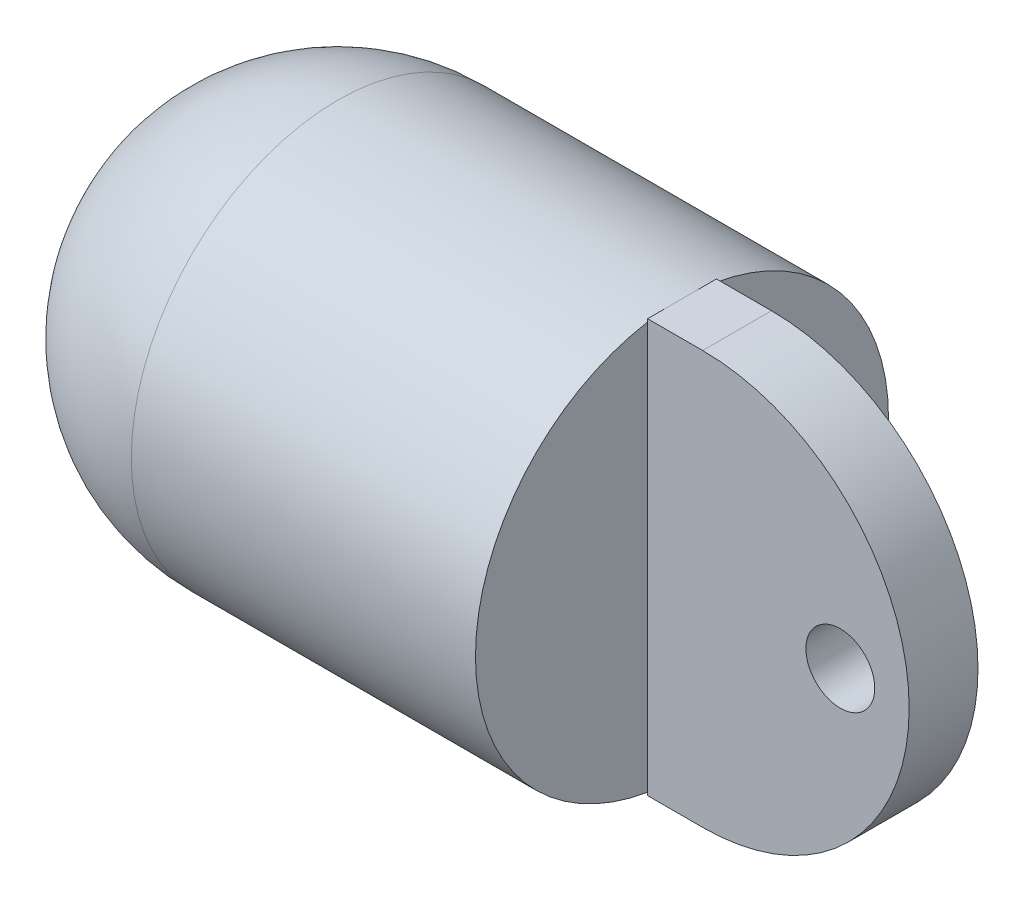
ISO-10303-21;
HEADER;
FILE_DESCRIPTION(('STEP AP214'),'2;1');
FILE_NAME('part.step','',(''),(''),'','','');
FILE_SCHEMA(('AUTOMOTIVE_DESIGN { 1 0 10303 214 1 1 1 1 }'));
ENDSEC;
DATA;
#1=APPLICATION_CONTEXT('core data for automotive mechanical design processes');
#2=APPLICATION_PROTOCOL_DEFINITION('international standard','automotive_design',2000,#1);
#3=PRODUCT_CONTEXT('',#1,'mechanical');
#4=PRODUCT('Part','Part','',(#3));
#5=PRODUCT_RELATED_PRODUCT_CATEGORY('part','',(#4));
#6=PRODUCT_DEFINITION_FORMATION('','',#4);
#7=PRODUCT_DEFINITION_CONTEXT('part definition',#1,'design');
#8=PRODUCT_DEFINITION('design','',#6,#7);
#9=PRODUCT_DEFINITION_SHAPE('','',#8);
#10=(LENGTH_UNIT() NAMED_UNIT(*) SI_UNIT(.MILLI.,.METRE.));
#11=(NAMED_UNIT(*) PLANE_ANGLE_UNIT() SI_UNIT($,.RADIAN.));
#12=(NAMED_UNIT(*) SI_UNIT($,.STERADIAN.) SOLID_ANGLE_UNIT());
#13=UNCERTAINTY_MEASURE_WITH_UNIT(LENGTH_MEASURE(1.E-05),#10,'distance_accuracy_value','');
#14=(GEOMETRIC_REPRESENTATION_CONTEXT(3) GLOBAL_UNCERTAINTY_ASSIGNED_CONTEXT((#13)) GLOBAL_UNIT_ASSIGNED_CONTEXT((#10,
#11,#12)) REPRESENTATION_CONTEXT('',''));
#15=CARTESIAN_POINT('',(0.,0.,0.));
#16=DIRECTION('',(0.,0.,1.));
#17=DIRECTION('',(1.,0.,0.));
#18=AXIS2_PLACEMENT_3D('',#15,#16,#17);
#19=CARTESIAN_POINT('',(0.,0.,0.));
#20=DIRECTION('',(1.,0.,0.));
#21=DIRECTION('',(0.,0.,-1.));
#22=AXIS2_PLACEMENT_3D('',#19,#20,#21);
#23=PLANE('',#22);
#24=DIRECTION('',(0.,1.,0.));
#25=VECTOR('',#24,1.);
#26=CARTESIAN_POINT('',(0.,15.,-2.5));
#27=LINE('',#26,#25);
#28=CARTESIAN_POINT('',(0.,-14.790199457749,-2.5));
#29=VERTEX_POINT('',#28);
#30=CARTESIAN_POINT('',(0.,14.790199457749,-2.5));
#31=VERTEX_POINT('',#30);
#32=EDGE_CURVE('E11',#29,#31,#27,.T.);
#33=ORIENTED_EDGE('',*,*,#32,.F.);
#34=CARTESIAN_POINT('',(0.,0.,0.));
#35=DIRECTION('',(1.,0.,0.));
#36=DIRECTION('',(0.,0.,-1.));
#37=AXIS2_PLACEMENT_3D('',#34,#35,#36);
#38=CIRCLE('',#37,15.);
#39=EDGE_CURVE('E165',#29,#31,#38,.T.);
#40=ORIENTED_EDGE('',*,*,#39,.T.);
#41=EDGE_LOOP('',(#33,#40));
#42=FACE_BOUND('',#41,.T.);
#43=ADVANCED_FACE('F39',(#42),#23,.T.);
#44=CARTESIAN_POINT('',(-25.,0.,0.));
#45=DIRECTION('',(1.,0.,0.));
#46=DIRECTION('',(0.,0.,-1.));
#47=AXIS2_PLACEMENT_3D('',#44,#45,#46);
#48=CYLINDRICAL_SURFACE('',#47,15.);
#49=CARTESIAN_POINT('',(-25.,0.,0.));
#50=DIRECTION('',(1.,0.,0.));
#51=DIRECTION('',(0.,0.,-1.));
#52=AXIS2_PLACEMENT_3D('',#49,#50,#51);
#53=CIRCLE('',#52,15.);
#54=CARTESIAN_POINT('',(-25.,0.,-15.));
#55=VERTEX_POINT('',#54);
#56=EDGE_CURVE('E243',#55,#55,#53,.F.);
#57=ORIENTED_EDGE('',*,*,#56,.F.);
#58=EDGE_LOOP('',(#57));
#59=FACE_BOUND('',#58,.T.);
#60=CARTESIAN_POINT('',(0.,15.,0.));
#61=VERTEX_POINT('',#60);
#62=EDGE_CURVE('E166',#31,#61,#38,.T.);
#63=ORIENTED_EDGE('',*,*,#62,.F.);
#64=ORIENTED_EDGE('',*,*,#39,.F.);
#65=CARTESIAN_POINT('',(0.,-15.,0.));
#66=VERTEX_POINT('',#65);
#67=EDGE_CURVE('E63',#66,#29,#38,.T.);
#68=ORIENTED_EDGE('',*,*,#67,.F.);
#69=CARTESIAN_POINT('',(0.,-14.790199457749,2.5));
#70=VERTEX_POINT('',#69);
#71=EDGE_CURVE('E181',#70,#66,#38,.T.);
#72=ORIENTED_EDGE('',*,*,#71,.F.);
#73=CARTESIAN_POINT('',(0.,14.790199457749,2.5));
#74=VERTEX_POINT('',#73);
#75=EDGE_CURVE('E178',#74,#70,#38,.T.);
#76=ORIENTED_EDGE('',*,*,#75,.F.);
#77=EDGE_CURVE('E169',#61,#74,#38,.T.);
#78=ORIENTED_EDGE('',*,*,#77,.F.);
#79=EDGE_LOOP('',(#63,#64,#68,#72,#76,#78));
#80=FACE_BOUND('',#79,.T.);
#81=ADVANCED_FACE('F41',(#59,#80),#48,.T.);
#82=DIRECTION('',(0.,-1.,0.));
#83=VECTOR('',#82,1.);
#84=CARTESIAN_POINT('',(0.,15.,2.5));
#85=LINE('',#84,#83);
#86=EDGE_CURVE('E49',#74,#70,#85,.T.);
#87=ORIENTED_EDGE('',*,*,#86,.F.);
#88=ORIENTED_EDGE('',*,*,#75,.T.);
#89=EDGE_LOOP('',(#87,#88));
#90=FACE_BOUND('',#89,.T.);
#91=ADVANCED_FACE('F190',(#90),#23,.T.);
#92=CARTESIAN_POINT('',(0.,0.,0.));
#93=DIRECTION('',(-1.,0.,0.));
#94=DIRECTION('',(0.,0.,1.));
#95=AXIS2_PLACEMENT_3D('',#92,#93,#94);
#96=PLANE('',#95);
#97=CARTESIAN_POINT('',(0.,15.,-2.5));
#98=VERTEX_POINT('',#97);
#99=EDGE_CURVE('E52',#31,#98,#27,.T.);
#100=ORIENTED_EDGE('',*,*,#99,.F.);
#101=ORIENTED_EDGE('',*,*,#62,.T.);
#102=DIRECTION('',(0.,0.,1.));
#103=VECTOR('',#102,1.);
#104=CARTESIAN_POINT('',(0.,15.,2.5));
#105=LINE('',#104,#103);
#106=EDGE_CURVE('E146',#98,#61,#105,.T.);
#107=ORIENTED_EDGE('',*,*,#106,.F.);
#108=EDGE_LOOP('',(#100,#101,#107));
#109=FACE_BOUND('',#108,.T.);
#110=ADVANCED_FACE('F196',(#109),#96,.T.);
#111=CARTESIAN_POINT('',(0.,15.,2.5));
#112=VERTEX_POINT('',#111);
#113=EDGE_CURVE('E139',#61,#112,#105,.T.);
#114=ORIENTED_EDGE('',*,*,#113,.F.);
#115=ORIENTED_EDGE('',*,*,#77,.T.);
#116=EDGE_CURVE('E150',#112,#74,#85,.T.);
#117=ORIENTED_EDGE('',*,*,#116,.F.);
#118=EDGE_LOOP('',(#114,#115,#117));
#119=FACE_BOUND('',#118,.T.);
#120=ADVANCED_FACE('F195',(#119),#96,.T.);
#121=CARTESIAN_POINT('',(0.,-15.,2.5));
#122=VERTEX_POINT('',#121);
#123=EDGE_CURVE('E126',#70,#122,#85,.T.);
#124=ORIENTED_EDGE('',*,*,#123,.F.);
#125=ORIENTED_EDGE('',*,*,#71,.T.);
#126=DIRECTION('',(0.,0.,-1.));
#127=VECTOR('',#126,1.);
#128=CARTESIAN_POINT('',(0.,-15.,2.5));
#129=LINE('',#128,#127);
#130=EDGE_CURVE('E154',#122,#66,#129,.T.);
#131=ORIENTED_EDGE('',*,*,#130,.F.);
#132=EDGE_LOOP('',(#124,#125,#131));
#133=FACE_BOUND('',#132,.T.);
#134=ADVANCED_FACE('F191',(#133),#96,.T.);
#135=CARTESIAN_POINT('',(4.,15.,2.5));
#136=DIRECTION('',(0.,-1.,0.));
#137=DIRECTION('',(0.,0.,-1.));
#138=AXIS2_PLACEMENT_3D('',#135,#136,#137);
#139=PLANE('',#138);
#140=ORIENTED_EDGE('',*,*,#106,.T.);
#141=ORIENTED_EDGE('',*,*,#113,.T.);
#142=DIRECTION('',(-1.,0.,0.));
#143=VECTOR('',#142,1.);
#144=CARTESIAN_POINT('',(4.,15.,2.5));
#145=LINE('',#144,#143);
#146=CARTESIAN_POINT('',(4.,15.,2.5));
#147=VERTEX_POINT('',#146);
#148=EDGE_CURVE('E128',#147,#112,#145,.T.);
#149=ORIENTED_EDGE('',*,*,#148,.F.);
#150=DIRECTION('',(0.,0.,1.));
#151=VECTOR('',#150,1.);
#152=CARTESIAN_POINT('',(4.,15.,2.5));
#153=LINE('',#152,#151);
#154=CARTESIAN_POINT('',(4.,15.,-2.5));
#155=VERTEX_POINT('',#154);
#156=EDGE_CURVE('E116',#155,#147,#153,.T.);
#157=ORIENTED_EDGE('',*,*,#156,.F.);
#158=DIRECTION('',(-1.,0.,0.));
#159=VECTOR('',#158,1.);
#160=CARTESIAN_POINT('',(4.,15.,-2.5));
#161=LINE('',#160,#159);
#162=EDGE_CURVE('E115',#155,#98,#161,.T.);
#163=ORIENTED_EDGE('',*,*,#162,.T.);
#164=EDGE_LOOP('',(#140,#141,#149,#157,#163));
#165=FACE_BOUND('',#164,.T.);
#166=ADVANCED_FACE('F204',(#165),#139,.F.);
#167=CARTESIAN_POINT('',(4.,15.,2.5));
#168=DIRECTION('',(0.,0.,-1.));
#169=DIRECTION('',(0.,1.,0.));
#170=AXIS2_PLACEMENT_3D('',#167,#168,#169);
#171=PLANE('',#170);
#172=CARTESIAN_POINT('',(14.,0.,2.5));
#173=DIRECTION('',(0.,0.,-1.));
#174=DIRECTION('',(0.,1.,0.));
#175=AXIS2_PLACEMENT_3D('',#172,#173,#174);
#176=CIRCLE('',#175,2.5);
#177=CARTESIAN_POINT('',(14.,2.5,2.5));
#178=VERTEX_POINT('',#177);
#179=EDGE_CURVE('E135',#178,#178,#176,.T.);
#180=ORIENTED_EDGE('',*,*,#179,.T.);
#181=EDGE_LOOP('',(#180));
#182=FACE_BOUND('',#181,.T.);
#183=ORIENTED_EDGE('',*,*,#116,.T.);
#184=ORIENTED_EDGE('',*,*,#86,.T.);
#185=ORIENTED_EDGE('',*,*,#123,.T.);
#186=DIRECTION('',(-1.,0.,0.));
#187=VECTOR('',#186,1.);
#188=CARTESIAN_POINT('',(4.,-15.,2.5));
#189=LINE('',#188,#187);
#190=CARTESIAN_POINT('',(4.,-15.,2.5));
#191=VERTEX_POINT('',#190);
#192=EDGE_CURVE('E106',#191,#122,#189,.T.);
#193=ORIENTED_EDGE('',*,*,#192,.F.);
#194=CARTESIAN_POINT('',(4.,0.,2.5));
#195=DIRECTION('',(0.,0.,1.));
#196=DIRECTION('',(1.,0.,0.));
#197=AXIS2_PLACEMENT_3D('',#194,#195,#196);
#198=CIRCLE('',#197,15.);
#199=EDGE_CURVE('E123',#191,#147,#198,.T.);
#200=ORIENTED_EDGE('',*,*,#199,.T.);
#201=ORIENTED_EDGE('',*,*,#148,.T.);
#202=EDGE_LOOP('',(#183,#184,#185,#193,#200,#201));
#203=FACE_BOUND('',#202,.T.);
#204=ADVANCED_FACE('F121',(#182,#203),#171,.F.);
#205=CARTESIAN_POINT('',(4.,-15.,2.5));
#206=DIRECTION('',(0.,1.,0.));
#207=DIRECTION('',(0.,0.,1.));
#208=AXIS2_PLACEMENT_3D('',#205,#206,#207);
#209=PLANE('',#208);
#210=ORIENTED_EDGE('',*,*,#130,.T.);
#211=CARTESIAN_POINT('',(0.,-15.,-2.5));
#212=VERTEX_POINT('',#211);
#213=EDGE_CURVE('E153',#66,#212,#129,.T.);
#214=ORIENTED_EDGE('',*,*,#213,.T.);
#215=DIRECTION('',(-1.,0.,0.));
#216=VECTOR('',#215,1.);
#217=CARTESIAN_POINT('',(4.,-15.,-2.5));
#218=LINE('',#217,#216);
#219=CARTESIAN_POINT('',(4.,-15.,-2.5));
#220=VERTEX_POINT('',#219);
#221=EDGE_CURVE('E109',#220,#212,#218,.T.);
#222=ORIENTED_EDGE('',*,*,#221,.F.);
#223=DIRECTION('',(0.,0.,-1.));
#224=VECTOR('',#223,1.);
#225=CARTESIAN_POINT('',(4.,-15.,2.5));
#226=LINE('',#225,#224);
#227=EDGE_CURVE('E102',#191,#220,#226,.T.);
#228=ORIENTED_EDGE('',*,*,#227,.F.);
#229=ORIENTED_EDGE('',*,*,#192,.T.);
#230=EDGE_LOOP('',(#210,#214,#222,#228,#229));
#231=FACE_BOUND('',#230,.T.);
#232=ADVANCED_FACE('F105',(#231),#209,.F.);
#233=CARTESIAN_POINT('',(4.,15.,-2.5));
#234=DIRECTION('',(0.,0.,1.));
#235=DIRECTION('',(0.,-1.,0.));
#236=AXIS2_PLACEMENT_3D('',#233,#234,#235);
#237=PLANE('',#236);
#238=CARTESIAN_POINT('',(14.,0.,-2.5));
#239=DIRECTION('',(0.,0.,1.));
#240=DIRECTION('',(0.,-1.,0.));
#241=AXIS2_PLACEMENT_3D('',#238,#239,#240);
#242=CIRCLE('',#241,2.5);
#243=CARTESIAN_POINT('',(14.,-2.5,-2.5));
#244=VERTEX_POINT('',#243);
#245=EDGE_CURVE('E43',#244,#244,#242,.T.);
#246=ORIENTED_EDGE('',*,*,#245,.T.);
#247=EDGE_LOOP('',(#246));
#248=FACE_BOUND('',#247,.T.);
#249=EDGE_CURVE('E51',#212,#29,#27,.T.);
#250=ORIENTED_EDGE('',*,*,#249,.T.);
#251=ORIENTED_EDGE('',*,*,#32,.T.);
#252=ORIENTED_EDGE('',*,*,#99,.T.);
#253=ORIENTED_EDGE('',*,*,#162,.F.);
#254=CARTESIAN_POINT('',(4.,0.,-2.5));
#255=DIRECTION('',(0.,0.,1.));
#256=DIRECTION('',(1.,0.,0.));
#257=AXIS2_PLACEMENT_3D('',#254,#255,#256);
#258=CIRCLE('',#257,15.);
#259=EDGE_CURVE('E134',#220,#155,#258,.T.);
#260=ORIENTED_EDGE('',*,*,#259,.F.);
#261=ORIENTED_EDGE('',*,*,#221,.T.);
#262=EDGE_LOOP('',(#250,#251,#252,#253,#260,#261));
#263=FACE_BOUND('',#262,.T.);
#264=ADVANCED_FACE('F199',(#248,#263),#237,.F.);
#265=ORIENTED_EDGE('',*,*,#213,.F.);
#266=ORIENTED_EDGE('',*,*,#67,.T.);
#267=ORIENTED_EDGE('',*,*,#249,.F.);
#268=EDGE_LOOP('',(#265,#266,#267));
#269=FACE_BOUND('',#268,.T.);
#270=ADVANCED_FACE('F200',(#269),#96,.T.);
#271=CARTESIAN_POINT('',(4.,0.,-2.5));
#272=DIRECTION('',(0.,0.,1.));
#273=DIRECTION('',(1.,0.,0.));
#274=AXIS2_PLACEMENT_3D('',#271,#272,#273);
#275=CYLINDRICAL_SURFACE('',#274,15.);
#276=ORIENTED_EDGE('',*,*,#199,.F.);
#277=ORIENTED_EDGE('',*,*,#227,.T.);
#278=ORIENTED_EDGE('',*,*,#259,.T.);
#279=ORIENTED_EDGE('',*,*,#156,.T.);
#280=EDGE_LOOP('',(#276,#277,#278,#279));
#281=FACE_BOUND('',#280,.T.);
#282=ADVANCED_FACE('F131',(#281),#275,.T.);
#283=CARTESIAN_POINT('',(14.,0.,-15.));
#284=DIRECTION('',(0.,0.,1.));
#285=DIRECTION('',(1.,0.,0.));
#286=AXIS2_PLACEMENT_3D('',#283,#284,#285);
#287=CYLINDRICAL_SURFACE('',#286,2.5);
#288=ORIENTED_EDGE('',*,*,#245,.F.);
#289=EDGE_LOOP('',(#288));
#290=FACE_BOUND('',#289,.T.);
#291=ORIENTED_EDGE('',*,*,#179,.F.);
#292=EDGE_LOOP('',(#291));
#293=FACE_BOUND('',#292,.T.);
#294=ADVANCED_FACE('F233',(#290,#293),#287,.F.);
#295=CARTESIAN_POINT('',(-25.,0.,0.));
#296=DIRECTION('',(0.,1.,0.));
#297=DIRECTION('',(0.,0.,-1.));
#298=AXIS2_PLACEMENT_3D('',#295,#296,#297);
#299=SPHERICAL_SURFACE('',#298,15.);
#300=CARTESIAN_POINT('',(-25.,0.,0.));
#301=DIRECTION('',(1.,0.,0.));
#302=DIRECTION('',(0.,0.,-1.));
#303=AXIS2_PLACEMENT_3D('',#300,#301,#302);
#304=SPHERICAL_SURFACE('',#303,15.);
#305=ORIENTED_EDGE('',*,*,#56,.T.);
#306=EDGE_LOOP('',(#305));
#307=FACE_BOUND('',#306,.T.);
#308=ADVANCED_FACE('F249',(#307),#304,.T.);
#309=CLOSED_SHELL('',(#43,#81,#91,#110,#120,#134,#166,#204,#232,#264,#270,#282,#294,#308));
#310=MANIFOLD_SOLID_BREP('B2',#309);
#311=ADVANCED_BREP_SHAPE_REPRESENTATION('',(#18,#310),#14);
#312=SHAPE_DEFINITION_REPRESENTATION(#9,#311);
ENDSEC;
END-ISO-10303-21;
